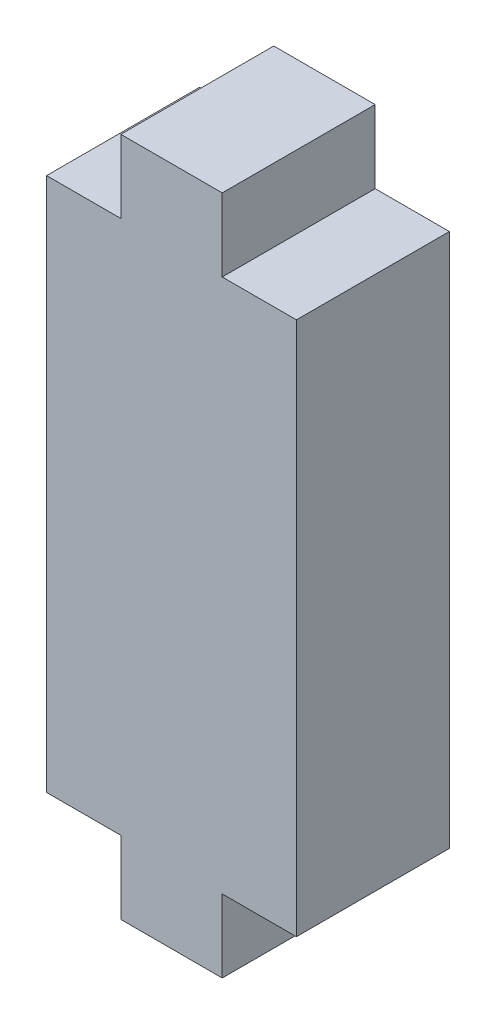
ISO-10303-21;
HEADER;
FILE_DESCRIPTION(('STEP AP214'),'2;1');
FILE_NAME('part.step','',(''),(''),'','','');
FILE_SCHEMA(('AUTOMOTIVE_DESIGN { 1 0 10303 214 1 1 1 1 }'));
ENDSEC;
DATA;
#1=APPLICATION_CONTEXT('core data for automotive mechanical design processes');
#2=APPLICATION_PROTOCOL_DEFINITION('international standard','automotive_design',2000,#1);
#3=PRODUCT_CONTEXT('',#1,'mechanical');
#4=PRODUCT('Part','Part','',(#3));
#5=PRODUCT_RELATED_PRODUCT_CATEGORY('part','',(#4));
#6=PRODUCT_DEFINITION_FORMATION('','',#4);
#7=PRODUCT_DEFINITION_CONTEXT('part definition',#1,'design');
#8=PRODUCT_DEFINITION('design','',#6,#7);
#9=PRODUCT_DEFINITION_SHAPE('','',#8);
#10=(LENGTH_UNIT() NAMED_UNIT(*) SI_UNIT(.MILLI.,.METRE.));
#11=(NAMED_UNIT(*) PLANE_ANGLE_UNIT() SI_UNIT($,.RADIAN.));
#12=(NAMED_UNIT(*) SI_UNIT($,.STERADIAN.) SOLID_ANGLE_UNIT());
#13=UNCERTAINTY_MEASURE_WITH_UNIT(LENGTH_MEASURE(1.E-05),#10,'distance_accuracy_value','');
#14=(GEOMETRIC_REPRESENTATION_CONTEXT(3) GLOBAL_UNCERTAINTY_ASSIGNED_CONTEXT((#13)) GLOBAL_UNIT_ASSIGNED_CONTEXT((#10,
#11,#12)) REPRESENTATION_CONTEXT('',''));
#15=CARTESIAN_POINT('',(0.,0.,0.));
#16=DIRECTION('',(0.,0.,1.));
#17=DIRECTION('',(1.,0.,0.));
#18=AXIS2_PLACEMENT_3D('',#15,#16,#17);
#19=CARTESIAN_POINT('',(11.4808,0.,10.));
#20=DIRECTION('',(-1.,0.,0.));
#21=DIRECTION('',(0.,-1.,0.));
#22=AXIS2_PLACEMENT_3D('',#19,#20,#21);
#23=PLANE('',#22);
#24=DIRECTION('',(0.,1.,0.));
#25=VECTOR('',#24,1.);
#26=CARTESIAN_POINT('',(11.4808,0.,0.));
#27=LINE('',#26,#25);
#28=CARTESIAN_POINT('',(11.4808,0.,0.));
#29=VERTEX_POINT('',#28);
#30=CARTESIAN_POINT('',(11.4808,4.7625,0.));
#31=VERTEX_POINT('',#30);
#32=EDGE_CURVE('E245',#29,#31,#27,.T.);
#33=ORIENTED_EDGE('',*,*,#32,.T.);
#34=DIRECTION('',(0.,0.,-1.));
#35=VECTOR('',#34,1.);
#36=CARTESIAN_POINT('',(11.4808,4.7625,10.));
#37=LINE('',#36,#35);
#38=CARTESIAN_POINT('',(11.4808,4.7625,10.));
#39=VERTEX_POINT('',#38);
#40=EDGE_CURVE('E12',#39,#31,#37,.T.);
#41=ORIENTED_EDGE('',*,*,#40,.F.);
#42=DIRECTION('',(0.,1.,0.));
#43=VECTOR('',#42,1.);
#44=CARTESIAN_POINT('',(11.4808,0.,10.));
#45=LINE('',#44,#43);
#46=CARTESIAN_POINT('',(11.4808,0.,10.));
#47=VERTEX_POINT('',#46);
#48=EDGE_CURVE('E198',#47,#39,#45,.T.);
#49=ORIENTED_EDGE('',*,*,#48,.F.);
#50=DIRECTION('',(0.,0.,-1.));
#51=VECTOR('',#50,1.);
#52=CARTESIAN_POINT('',(11.4808,0.,10.));
#53=LINE('',#52,#51);
#54=EDGE_CURVE('E154',#47,#29,#53,.T.);
#55=ORIENTED_EDGE('',*,*,#54,.T.);
#56=EDGE_LOOP('',(#33,#41,#49,#55));
#57=FACE_BOUND('',#56,.T.);
#58=ADVANCED_FACE('F35',(#57),#23,.F.);
#59=CARTESIAN_POINT('',(11.4808,4.7625,10.));
#60=DIRECTION('',(0.,1.,0.));
#61=DIRECTION('',(0.,0.,1.));
#62=AXIS2_PLACEMENT_3D('',#59,#60,#61);
#63=PLANE('',#62);
#64=DIRECTION('',(1.,0.,0.));
#65=VECTOR('',#64,1.);
#66=CARTESIAN_POINT('',(11.4808,4.7625,0.));
#67=LINE('',#66,#65);
#68=CARTESIAN_POINT('',(16.3322,4.7625,0.));
#69=VERTEX_POINT('',#68);
#70=EDGE_CURVE('E239',#31,#69,#67,.T.);
#71=ORIENTED_EDGE('',*,*,#70,.T.);
#72=DIRECTION('',(0.,0.,-1.));
#73=VECTOR('',#72,1.);
#74=CARTESIAN_POINT('',(16.3322,4.7625,10.));
#75=LINE('',#74,#73);
#76=CARTESIAN_POINT('',(16.3322,4.7625,10.));
#77=VERTEX_POINT('',#76);
#78=EDGE_CURVE('E43',#77,#69,#75,.T.);
#79=ORIENTED_EDGE('',*,*,#78,.F.);
#80=DIRECTION('',(1.,0.,0.));
#81=VECTOR('',#80,1.);
#82=CARTESIAN_POINT('',(11.4808,4.7625,10.));
#83=LINE('',#82,#81);
#84=EDGE_CURVE('E106',#39,#77,#83,.T.);
#85=ORIENTED_EDGE('',*,*,#84,.F.);
#86=ORIENTED_EDGE('',*,*,#40,.T.);
#87=EDGE_LOOP('',(#71,#79,#85,#86));
#88=FACE_BOUND('',#87,.T.);
#89=ADVANCED_FACE('F274',(#88),#63,.F.);
#90=CARTESIAN_POINT('',(16.3322,39.6875,10.));
#91=DIRECTION('',(-1.,0.,0.));
#92=DIRECTION('',(0.,-1.,0.));
#93=AXIS2_PLACEMENT_3D('',#90,#91,#92);
#94=PLANE('',#93);
#95=DIRECTION('',(0.,1.,0.));
#96=VECTOR('',#95,1.);
#97=CARTESIAN_POINT('',(16.3322,39.6875,0.));
#98=LINE('',#97,#96);
#99=CARTESIAN_POINT('',(16.3322,39.6875,0.));
#100=VERTEX_POINT('',#99);
#101=EDGE_CURVE('E234',#69,#100,#98,.T.);
#102=ORIENTED_EDGE('',*,*,#101,.T.);
#103=DIRECTION('',(0.,0.,-1.));
#104=VECTOR('',#103,1.);
#105=CARTESIAN_POINT('',(16.3322,39.6875,10.));
#106=LINE('',#105,#104);
#107=CARTESIAN_POINT('',(16.3322,39.6875,10.));
#108=VERTEX_POINT('',#107);
#109=EDGE_CURVE('E226',#108,#100,#106,.T.);
#110=ORIENTED_EDGE('',*,*,#109,.F.);
#111=DIRECTION('',(0.,1.,0.));
#112=VECTOR('',#111,1.);
#113=CARTESIAN_POINT('',(16.3322,39.6875,10.));
#114=LINE('',#113,#112);
#115=EDGE_CURVE('E190',#77,#108,#114,.T.);
#116=ORIENTED_EDGE('',*,*,#115,.F.);
#117=ORIENTED_EDGE('',*,*,#78,.T.);
#118=EDGE_LOOP('',(#102,#110,#116,#117));
#119=FACE_BOUND('',#118,.T.);
#120=ADVANCED_FACE('F232',(#119),#94,.F.);
#121=CARTESIAN_POINT('',(11.4808,39.6875,10.));
#122=DIRECTION('',(0.,-1.,0.));
#123=DIRECTION('',(0.,0.,-1.));
#124=AXIS2_PLACEMENT_3D('',#121,#122,#123);
#125=PLANE('',#124);
#126=DIRECTION('',(-1.,0.,0.));
#127=VECTOR('',#126,1.);
#128=CARTESIAN_POINT('',(11.4808,39.6875,0.));
#129=LINE('',#128,#127);
#130=CARTESIAN_POINT('',(11.4808,39.6875,0.));
#131=VERTEX_POINT('',#130);
#132=EDGE_CURVE('E241',#100,#131,#129,.T.);
#133=ORIENTED_EDGE('',*,*,#132,.T.);
#134=DIRECTION('',(0.,0.,-1.));
#135=VECTOR('',#134,1.);
#136=CARTESIAN_POINT('',(11.4808,39.6875,10.));
#137=LINE('',#136,#135);
#138=CARTESIAN_POINT('',(11.4808,39.6875,10.));
#139=VERTEX_POINT('',#138);
#140=EDGE_CURVE('E223',#139,#131,#137,.T.);
#141=ORIENTED_EDGE('',*,*,#140,.F.);
#142=DIRECTION('',(-1.,0.,0.));
#143=VECTOR('',#142,1.);
#144=CARTESIAN_POINT('',(11.4808,39.6875,10.));
#145=LINE('',#144,#143);
#146=EDGE_CURVE('E186',#108,#139,#145,.T.);
#147=ORIENTED_EDGE('',*,*,#146,.F.);
#148=ORIENTED_EDGE('',*,*,#109,.T.);
#149=EDGE_LOOP('',(#133,#141,#147,#148));
#150=FACE_BOUND('',#149,.T.);
#151=ADVANCED_FACE('F281',(#150),#125,.F.);
#152=CARTESIAN_POINT('',(11.4808,44.45,10.));
#153=DIRECTION('',(-1.,0.,0.));
#154=DIRECTION('',(0.,0.,1.));
#155=AXIS2_PLACEMENT_3D('',#152,#153,#154);
#156=PLANE('',#155);
#157=DIRECTION('',(0.,1.,0.));
#158=VECTOR('',#157,1.);
#159=CARTESIAN_POINT('',(11.4808,44.45,0.));
#160=LINE('',#159,#158);
#161=CARTESIAN_POINT('',(11.4808,44.45,0.));
#162=VERTEX_POINT('',#161);
#163=EDGE_CURVE('E243',#131,#162,#160,.T.);
#164=ORIENTED_EDGE('',*,*,#163,.T.);
#165=DIRECTION('',(0.,0.,-1.));
#166=VECTOR('',#165,1.);
#167=CARTESIAN_POINT('',(11.4808,44.45,10.));
#168=LINE('',#167,#166);
#169=CARTESIAN_POINT('',(11.4808,44.45,10.));
#170=VERTEX_POINT('',#169);
#171=EDGE_CURVE('E220',#170,#162,#168,.T.);
#172=ORIENTED_EDGE('',*,*,#171,.F.);
#173=DIRECTION('',(0.,1.,0.));
#174=VECTOR('',#173,1.);
#175=CARTESIAN_POINT('',(11.4808,44.45,10.));
#176=LINE('',#175,#174);
#177=EDGE_CURVE('E183',#139,#170,#176,.T.);
#178=ORIENTED_EDGE('',*,*,#177,.F.);
#179=ORIENTED_EDGE('',*,*,#140,.T.);
#180=EDGE_LOOP('',(#164,#172,#178,#179));
#181=FACE_BOUND('',#180,.T.);
#182=ADVANCED_FACE('F286',(#181),#156,.F.);
#183=CARTESIAN_POINT('',(4.8514,44.45,10.));
#184=DIRECTION('',(0.,-1.,0.));
#185=DIRECTION('',(0.,0.,-1.));
#186=AXIS2_PLACEMENT_3D('',#183,#184,#185);
#187=PLANE('',#186);
#188=DIRECTION('',(-1.,0.,0.));
#189=VECTOR('',#188,1.);
#190=CARTESIAN_POINT('',(4.8514,44.45,0.));
#191=LINE('',#190,#189);
#192=CARTESIAN_POINT('',(4.8514,44.45,0.));
#193=VERTEX_POINT('',#192);
#194=EDGE_CURVE('E249',#162,#193,#191,.T.);
#195=ORIENTED_EDGE('',*,*,#194,.T.);
#196=DIRECTION('',(0.,0.,-1.));
#197=VECTOR('',#196,1.);
#198=CARTESIAN_POINT('',(4.8514,44.45,10.));
#199=LINE('',#198,#197);
#200=CARTESIAN_POINT('',(4.8514,44.45,10.));
#201=VERTEX_POINT('',#200);
#202=EDGE_CURVE('E217',#201,#193,#199,.T.);
#203=ORIENTED_EDGE('',*,*,#202,.F.);
#204=DIRECTION('',(-1.,0.,0.));
#205=VECTOR('',#204,1.);
#206=CARTESIAN_POINT('',(4.8514,44.45,10.));
#207=LINE('',#206,#205);
#208=EDGE_CURVE('E175',#170,#201,#207,.T.);
#209=ORIENTED_EDGE('',*,*,#208,.F.);
#210=ORIENTED_EDGE('',*,*,#171,.T.);
#211=EDGE_LOOP('',(#195,#203,#209,#210));
#212=FACE_BOUND('',#211,.T.);
#213=ADVANCED_FACE('F290',(#212),#187,.F.);
#214=CARTESIAN_POINT('',(4.8514,39.6875,10.));
#215=DIRECTION('',(1.,0.,0.));
#216=DIRECTION('',(0.,0.,-1.));
#217=AXIS2_PLACEMENT_3D('',#214,#215,#216);
#218=PLANE('',#217);
#219=DIRECTION('',(0.,-1.,0.));
#220=VECTOR('',#219,1.);
#221=CARTESIAN_POINT('',(4.8514,39.6875,0.));
#222=LINE('',#221,#220);
#223=CARTESIAN_POINT('',(4.8514,39.6875,0.));
#224=VERTEX_POINT('',#223);
#225=EDGE_CURVE('E251',#193,#224,#222,.T.);
#226=ORIENTED_EDGE('',*,*,#225,.T.);
#227=DIRECTION('',(0.,0.,-1.));
#228=VECTOR('',#227,1.);
#229=CARTESIAN_POINT('',(4.8514,39.6875,10.));
#230=LINE('',#229,#228);
#231=CARTESIAN_POINT('',(4.8514,39.6875,10.));
#232=VERTEX_POINT('',#231);
#233=EDGE_CURVE('E214',#232,#224,#230,.T.);
#234=ORIENTED_EDGE('',*,*,#233,.F.);
#235=DIRECTION('',(0.,-1.,0.));
#236=VECTOR('',#235,1.);
#237=CARTESIAN_POINT('',(4.8514,39.6875,10.));
#238=LINE('',#237,#236);
#239=EDGE_CURVE('E171',#201,#232,#238,.T.);
#240=ORIENTED_EDGE('',*,*,#239,.F.);
#241=ORIENTED_EDGE('',*,*,#202,.T.);
#242=EDGE_LOOP('',(#226,#234,#240,#241));
#243=FACE_BOUND('',#242,.T.);
#244=ADVANCED_FACE('F294',(#243),#218,.F.);
#245=CARTESIAN_POINT('',(0.,39.6875,10.));
#246=DIRECTION('',(0.,-1.,0.));
#247=DIRECTION('',(0.,0.,-1.));
#248=AXIS2_PLACEMENT_3D('',#245,#246,#247);
#249=PLANE('',#248);
#250=DIRECTION('',(-1.,0.,0.));
#251=VECTOR('',#250,1.);
#252=CARTESIAN_POINT('',(0.,39.6875,0.));
#253=LINE('',#252,#251);
#254=CARTESIAN_POINT('',(0.,39.6875,0.));
#255=VERTEX_POINT('',#254);
#256=EDGE_CURVE('E253',#224,#255,#253,.T.);
#257=ORIENTED_EDGE('',*,*,#256,.T.);
#258=DIRECTION('',(0.,0.,-1.));
#259=VECTOR('',#258,1.);
#260=CARTESIAN_POINT('',(0.,39.6875,10.));
#261=LINE('',#260,#259);
#262=CARTESIAN_POINT('',(0.,39.6875,10.));
#263=VERTEX_POINT('',#262);
#264=EDGE_CURVE('E211',#263,#255,#261,.T.);
#265=ORIENTED_EDGE('',*,*,#264,.F.);
#266=DIRECTION('',(-1.,0.,0.));
#267=VECTOR('',#266,1.);
#268=CARTESIAN_POINT('',(0.,39.6875,10.));
#269=LINE('',#268,#267);
#270=EDGE_CURVE('E167',#232,#263,#269,.T.);
#271=ORIENTED_EDGE('',*,*,#270,.F.);
#272=ORIENTED_EDGE('',*,*,#233,.T.);
#273=EDGE_LOOP('',(#257,#265,#271,#272));
#274=FACE_BOUND('',#273,.T.);
#275=ADVANCED_FACE('F298',(#274),#249,.F.);
#276=CARTESIAN_POINT('',(0.,4.7625,10.));
#277=DIRECTION('',(1.,0.,0.));
#278=DIRECTION('',(0.,0.,-1.));
#279=AXIS2_PLACEMENT_3D('',#276,#277,#278);
#280=PLANE('',#279);
#281=DIRECTION('',(0.,-1.,0.));
#282=VECTOR('',#281,1.);
#283=CARTESIAN_POINT('',(0.,4.7625,0.));
#284=LINE('',#283,#282);
#285=CARTESIAN_POINT('',(0.,4.7625,0.));
#286=VERTEX_POINT('',#285);
#287=EDGE_CURVE('E255',#255,#286,#284,.T.);
#288=ORIENTED_EDGE('',*,*,#287,.T.);
#289=DIRECTION('',(0.,0.,-1.));
#290=VECTOR('',#289,1.);
#291=CARTESIAN_POINT('',(0.,4.7625,10.));
#292=LINE('',#291,#290);
#293=CARTESIAN_POINT('',(0.,4.7625,10.));
#294=VERTEX_POINT('',#293);
#295=EDGE_CURVE('E147',#294,#286,#292,.T.);
#296=ORIENTED_EDGE('',*,*,#295,.F.);
#297=DIRECTION('',(0.,-1.,0.));
#298=VECTOR('',#297,1.);
#299=CARTESIAN_POINT('',(0.,4.7625,10.));
#300=LINE('',#299,#298);
#301=EDGE_CURVE('E137',#263,#294,#300,.T.);
#302=ORIENTED_EDGE('',*,*,#301,.F.);
#303=ORIENTED_EDGE('',*,*,#264,.T.);
#304=EDGE_LOOP('',(#288,#296,#302,#303));
#305=FACE_BOUND('',#304,.T.);
#306=ADVANCED_FACE('F258',(#305),#280,.F.);
#307=CARTESIAN_POINT('',(4.8514,4.7625,10.));
#308=DIRECTION('',(0.,1.,0.));
#309=DIRECTION('',(0.,0.,1.));
#310=AXIS2_PLACEMENT_3D('',#307,#308,#309);
#311=PLANE('',#310);
#312=DIRECTION('',(1.,0.,0.));
#313=VECTOR('',#312,1.);
#314=CARTESIAN_POINT('',(4.8514,4.7625,0.));
#315=LINE('',#314,#313);
#316=CARTESIAN_POINT('',(4.8514,4.7625,0.));
#317=VERTEX_POINT('',#316);
#318=EDGE_CURVE('E146',#286,#317,#315,.T.);
#319=ORIENTED_EDGE('',*,*,#318,.T.);
#320=DIRECTION('',(0.,0.,-1.));
#321=VECTOR('',#320,1.);
#322=CARTESIAN_POINT('',(4.8514,4.7625,10.));
#323=LINE('',#322,#321);
#324=CARTESIAN_POINT('',(4.8514,4.7625,10.));
#325=VERTEX_POINT('',#324);
#326=EDGE_CURVE('E143',#325,#317,#323,.T.);
#327=ORIENTED_EDGE('',*,*,#326,.F.);
#328=DIRECTION('',(1.,0.,0.));
#329=VECTOR('',#328,1.);
#330=CARTESIAN_POINT('',(4.8514,4.7625,10.));
#331=LINE('',#330,#329);
#332=EDGE_CURVE('E131',#294,#325,#331,.T.);
#333=ORIENTED_EDGE('',*,*,#332,.F.);
#334=ORIENTED_EDGE('',*,*,#295,.T.);
#335=EDGE_LOOP('',(#319,#327,#333,#334));
#336=FACE_BOUND('',#335,.T.);
#337=ADVANCED_FACE('F144',(#336),#311,.F.);
#338=CARTESIAN_POINT('',(4.8514,0.,10.));
#339=DIRECTION('',(1.,0.,0.));
#340=DIRECTION('',(0.,0.,-1.));
#341=AXIS2_PLACEMENT_3D('',#338,#339,#340);
#342=PLANE('',#341);
#343=DIRECTION('',(0.,-1.,0.));
#344=VECTOR('',#343,1.);
#345=CARTESIAN_POINT('',(4.8514,0.,0.));
#346=LINE('',#345,#344);
#347=CARTESIAN_POINT('',(4.8514,0.,0.));
#348=VERTEX_POINT('',#347);
#349=EDGE_CURVE('E92',#317,#348,#346,.T.);
#350=ORIENTED_EDGE('',*,*,#349,.T.);
#351=DIRECTION('',(0.,0.,-1.));
#352=VECTOR('',#351,1.);
#353=CARTESIAN_POINT('',(4.8514,0.,10.));
#354=LINE('',#353,#352);
#355=CARTESIAN_POINT('',(4.8514,0.,10.));
#356=VERTEX_POINT('',#355);
#357=EDGE_CURVE('E148',#356,#348,#354,.T.);
#358=ORIENTED_EDGE('',*,*,#357,.F.);
#359=DIRECTION('',(0.,-1.,0.));
#360=VECTOR('',#359,1.);
#361=CARTESIAN_POINT('',(4.8514,0.,10.));
#362=LINE('',#361,#360);
#363=EDGE_CURVE('E135',#325,#356,#362,.T.);
#364=ORIENTED_EDGE('',*,*,#363,.F.);
#365=ORIENTED_EDGE('',*,*,#326,.T.);
#366=EDGE_LOOP('',(#350,#358,#364,#365));
#367=FACE_BOUND('',#366,.T.);
#368=ADVANCED_FACE('F150',(#367),#342,.F.);
#369=CARTESIAN_POINT('',(4.8514,0.,10.));
#370=DIRECTION('',(0.,1.,0.));
#371=DIRECTION('',(-1.,0.,0.));
#372=AXIS2_PLACEMENT_3D('',#369,#370,#371);
#373=PLANE('',#372);
#374=DIRECTION('',(1.,0.,0.));
#375=VECTOR('',#374,1.);
#376=CARTESIAN_POINT('',(4.8514,0.,0.));
#377=LINE('',#376,#375);
#378=EDGE_CURVE('E98',#348,#29,#377,.T.);
#379=ORIENTED_EDGE('',*,*,#378,.T.);
#380=ORIENTED_EDGE('',*,*,#54,.F.);
#381=DIRECTION('',(1.,0.,0.));
#382=VECTOR('',#381,1.);
#383=CARTESIAN_POINT('',(4.8514,0.,10.));
#384=LINE('',#383,#382);
#385=EDGE_CURVE('E51',#356,#47,#384,.T.);
#386=ORIENTED_EDGE('',*,*,#385,.F.);
#387=ORIENTED_EDGE('',*,*,#357,.T.);
#388=EDGE_LOOP('',(#379,#380,#386,#387));
#389=FACE_BOUND('',#388,.T.);
#390=ADVANCED_FACE('F263',(#389),#373,.F.);
#391=CARTESIAN_POINT('',(0.,0.,10.));
#392=DIRECTION('',(0.,0.,-1.));
#393=DIRECTION('',(-1.,0.,0.));
#394=AXIS2_PLACEMENT_3D('',#391,#392,#393);
#395=PLANE('',#394);
#396=ORIENTED_EDGE('',*,*,#48,.T.);
#397=ORIENTED_EDGE('',*,*,#84,.T.);
#398=ORIENTED_EDGE('',*,*,#115,.T.);
#399=ORIENTED_EDGE('',*,*,#146,.T.);
#400=ORIENTED_EDGE('',*,*,#177,.T.);
#401=ORIENTED_EDGE('',*,*,#208,.T.);
#402=ORIENTED_EDGE('',*,*,#239,.T.);
#403=ORIENTED_EDGE('',*,*,#270,.T.);
#404=ORIENTED_EDGE('',*,*,#301,.T.);
#405=ORIENTED_EDGE('',*,*,#332,.T.);
#406=ORIENTED_EDGE('',*,*,#363,.T.);
#407=ORIENTED_EDGE('',*,*,#385,.T.);
#408=EDGE_LOOP('',(#396,#397,#398,#399,#400,#401,#402,#403,#404,#405,#406,#407));
#409=FACE_BOUND('',#408,.T.);
#410=ADVANCED_FACE('F133',(#409),#395,.F.);
#411=CARTESIAN_POINT('',(0.,0.,0.));
#412=DIRECTION('',(0.,0.,-1.));
#413=DIRECTION('',(-1.,0.,0.));
#414=AXIS2_PLACEMENT_3D('',#411,#412,#413);
#415=PLANE('',#414);
#416=ORIENTED_EDGE('',*,*,#32,.F.);
#417=ORIENTED_EDGE('',*,*,#378,.F.);
#418=ORIENTED_EDGE('',*,*,#349,.F.);
#419=ORIENTED_EDGE('',*,*,#318,.F.);
#420=ORIENTED_EDGE('',*,*,#287,.F.);
#421=ORIENTED_EDGE('',*,*,#256,.F.);
#422=ORIENTED_EDGE('',*,*,#225,.F.);
#423=ORIENTED_EDGE('',*,*,#194,.F.);
#424=ORIENTED_EDGE('',*,*,#163,.F.);
#425=ORIENTED_EDGE('',*,*,#132,.F.);
#426=ORIENTED_EDGE('',*,*,#101,.F.);
#427=ORIENTED_EDGE('',*,*,#70,.F.);
#428=EDGE_LOOP('',(#416,#417,#418,#419,#420,#421,#422,#423,#424,#425,#426,#427));
#429=FACE_BOUND('',#428,.T.);
#430=ADVANCED_FACE('F238',(#429),#415,.T.);
#431=CLOSED_SHELL('',(#58,#89,#120,#151,#182,#213,#244,#275,#306,#337,#368,#390,#410,#430));
#432=MANIFOLD_SOLID_BREP('B2',#431);
#433=ADVANCED_BREP_SHAPE_REPRESENTATION('',(#18,#432),#14);
#434=SHAPE_DEFINITION_REPRESENTATION(#9,#433);
ENDSEC;
END-ISO-10303-21;
